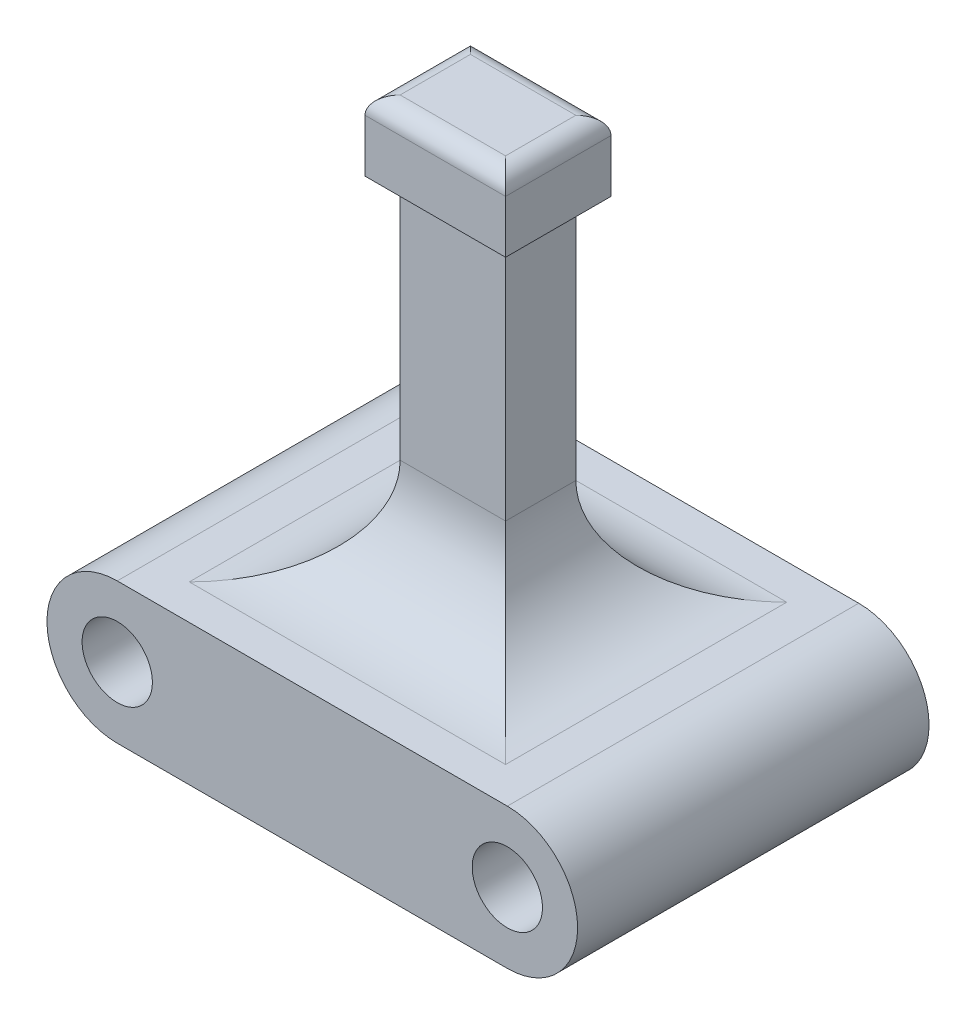
ISO-10303-21;
HEADER;
FILE_DESCRIPTION(('STEP AP214'),'2;1');
FILE_NAME('part.step','',(''),(''),'','','');
FILE_SCHEMA(('AUTOMOTIVE_DESIGN { 1 0 10303 214 1 1 1 1 }'));
ENDSEC;
DATA;
#1=APPLICATION_CONTEXT('core data for automotive mechanical design processes');
#2=APPLICATION_PROTOCOL_DEFINITION('international standard','automotive_design',2000,#1);
#3=PRODUCT_CONTEXT('',#1,'mechanical');
#4=PRODUCT('Part','Part','',(#3));
#5=PRODUCT_RELATED_PRODUCT_CATEGORY('part','',(#4));
#6=PRODUCT_DEFINITION_FORMATION('','',#4);
#7=PRODUCT_DEFINITION_CONTEXT('part definition',#1,'design');
#8=PRODUCT_DEFINITION('design','',#6,#7);
#9=PRODUCT_DEFINITION_SHAPE('','',#8);
#10=(LENGTH_UNIT() NAMED_UNIT(*) SI_UNIT(.MILLI.,.METRE.));
#11=(NAMED_UNIT(*) PLANE_ANGLE_UNIT() SI_UNIT($,.RADIAN.));
#12=(NAMED_UNIT(*) SI_UNIT($,.STERADIAN.) SOLID_ANGLE_UNIT());
#13=UNCERTAINTY_MEASURE_WITH_UNIT(LENGTH_MEASURE(1.E-05),#10,'distance_accuracy_value','');
#14=(GEOMETRIC_REPRESENTATION_CONTEXT(3) GLOBAL_UNCERTAINTY_ASSIGNED_CONTEXT((#13)) GLOBAL_UNIT_ASSIGNED_CONTEXT((#10,
#11,#12)) REPRESENTATION_CONTEXT('',''));
#15=CARTESIAN_POINT('',(0.,0.,0.));
#16=DIRECTION('',(0.,0.,1.));
#17=DIRECTION('',(1.,0.,0.));
#18=AXIS2_PLACEMENT_3D('',#15,#16,#17);
#19=CARTESIAN_POINT('',(0.,2.,10.));
#20=DIRECTION('',(0.,1.,0.));
#21=DIRECTION('',(-1.,0.,0.));
#22=AXIS2_PLACEMENT_3D('',#19,#20,#21);
#23=PLANE('',#22);
#24=DIRECTION('',(0.,0.,1.));
#25=VECTOR('',#24,1.);
#26=CARTESIAN_POINT('',(-4.5,2.,10.));
#27=LINE('',#26,#25);
#28=CARTESIAN_POINT('',(-4.5,2.,9.));
#29=VERTEX_POINT('',#28);
#30=CARTESIAN_POINT('',(-4.5,2.,1.));
#31=VERTEX_POINT('',#30);
#32=EDGE_CURVE('E293',#29,#31,#27,.F.);
#33=ORIENTED_EDGE('',*,*,#32,.T.);
#34=DIRECTION('',(-1.,0.,0.));
#35=VECTOR('',#34,1.);
#36=CARTESIAN_POINT('',(0.,2.,0.999999999999999));
#37=LINE('',#36,#35);
#38=CARTESIAN_POINT('',(4.5,2.,1.));
#39=VERTEX_POINT('',#38);
#40=EDGE_CURVE('E283',#31,#39,#37,.F.);
#41=ORIENTED_EDGE('',*,*,#40,.T.);
#42=DIRECTION('',(0.,0.,-1.));
#43=VECTOR('',#42,1.);
#44=CARTESIAN_POINT('',(4.5,2.,10.));
#45=LINE('',#44,#43);
#46=CARTESIAN_POINT('',(4.5,2.,9.));
#47=VERTEX_POINT('',#46);
#48=EDGE_CURVE('E287',#39,#47,#45,.F.);
#49=ORIENTED_EDGE('',*,*,#48,.T.);
#50=DIRECTION('',(1.,0.,0.));
#51=VECTOR('',#50,1.);
#52=CARTESIAN_POINT('',(0.,2.,9.));
#53=LINE('',#52,#51);
#54=EDGE_CURVE('E290',#47,#29,#53,.F.);
#55=ORIENTED_EDGE('',*,*,#54,.T.);
#56=EDGE_LOOP('',(#33,#41,#49,#55));
#57=FACE_BOUND('',#56,.T.);
#58=DIRECTION('',(1.,0.,0.));
#59=VECTOR('',#58,1.);
#60=CARTESIAN_POINT('',(0.,2.,0.));
#61=LINE('',#60,#59);
#62=CARTESIAN_POINT('',(-5.55,2.,0.));
#63=VERTEX_POINT('',#62);
#64=CARTESIAN_POINT('',(5.55,2.,0.));
#65=VERTEX_POINT('',#64);
#66=EDGE_CURVE('E318',#63,#65,#61,.T.);
#67=ORIENTED_EDGE('',*,*,#66,.F.);
#68=DIRECTION('',(0.,0.,-1.));
#69=VECTOR('',#68,1.);
#70=CARTESIAN_POINT('',(-5.55,2.,10.));
#71=LINE('',#70,#69);
#72=CARTESIAN_POINT('',(-5.55,2.,10.));
#73=VERTEX_POINT('',#72);
#74=EDGE_CURVE('E306',#73,#63,#71,.T.);
#75=ORIENTED_EDGE('',*,*,#74,.F.);
#76=DIRECTION('',(1.,0.,0.));
#77=VECTOR('',#76,1.);
#78=CARTESIAN_POINT('',(0.,2.,10.));
#79=LINE('',#78,#77);
#80=CARTESIAN_POINT('',(5.55,2.,10.));
#81=VERTEX_POINT('',#80);
#82=EDGE_CURVE('E341',#73,#81,#79,.T.);
#83=ORIENTED_EDGE('',*,*,#82,.T.);
#84=DIRECTION('',(0.,0.,-1.));
#85=VECTOR('',#84,1.);
#86=CARTESIAN_POINT('',(5.55,2.,10.));
#87=LINE('',#86,#85);
#88=EDGE_CURVE('E303',#81,#65,#87,.T.);
#89=ORIENTED_EDGE('',*,*,#88,.T.);
#90=EDGE_LOOP('',(#67,#75,#83,#89));
#91=FACE_BOUND('',#90,.T.);
#92=ADVANCED_FACE('F41',(#57,#91),#23,.T.);
#93=CARTESIAN_POINT('',(0.,-2.,10.));
#94=DIRECTION('',(0.,-1.,0.));
#95=DIRECTION('',(1.,0.,0.));
#96=AXIS2_PLACEMENT_3D('',#93,#94,#95);
#97=PLANE('',#96);
#98=DIRECTION('',(-1.,0.,0.));
#99=VECTOR('',#98,1.);
#100=CARTESIAN_POINT('',(0.,-2.,0.));
#101=LINE('',#100,#99);
#102=CARTESIAN_POINT('',(5.55,-2.,0.));
#103=VERTEX_POINT('',#102);
#104=CARTESIAN_POINT('',(-5.55,-2.,0.));
#105=VERTEX_POINT('',#104);
#106=EDGE_CURVE('E326',#103,#105,#101,.T.);
#107=ORIENTED_EDGE('',*,*,#106,.F.);
#108=DIRECTION('',(0.,0.,-1.));
#109=VECTOR('',#108,1.);
#110=CARTESIAN_POINT('',(5.55,-2.,10.));
#111=LINE('',#110,#109);
#112=CARTESIAN_POINT('',(5.55,-2.,10.));
#113=VERTEX_POINT('',#112);
#114=EDGE_CURVE('E300',#113,#103,#111,.T.);
#115=ORIENTED_EDGE('',*,*,#114,.F.);
#116=DIRECTION('',(-1.,0.,0.));
#117=VECTOR('',#116,1.);
#118=CARTESIAN_POINT('',(0.,-2.,10.));
#119=LINE('',#118,#117);
#120=CARTESIAN_POINT('',(-5.55,-2.,10.));
#121=VERTEX_POINT('',#120);
#122=EDGE_CURVE('E348',#113,#121,#119,.T.);
#123=ORIENTED_EDGE('',*,*,#122,.T.);
#124=DIRECTION('',(0.,0.,-1.));
#125=VECTOR('',#124,1.);
#126=CARTESIAN_POINT('',(-5.55,-2.,10.));
#127=LINE('',#126,#125);
#128=EDGE_CURVE('E309',#121,#105,#127,.T.);
#129=ORIENTED_EDGE('',*,*,#128,.T.);
#130=EDGE_LOOP('',(#107,#115,#123,#129));
#131=FACE_BOUND('',#130,.T.);
#132=ADVANCED_FACE('F408',(#131),#97,.T.);
#133=CARTESIAN_POINT('',(5.55,0.,10.));
#134=DIRECTION('',(0.,0.,-1.));
#135=DIRECTION('',(-1.,0.,0.));
#136=AXIS2_PLACEMENT_3D('',#133,#134,#135);
#137=CYLINDRICAL_SURFACE('',#136,2.);
#138=CARTESIAN_POINT('',(5.55,0.,0.));
#139=DIRECTION('',(0.,0.,1.));
#140=DIRECTION('',(1.,0.,0.));
#141=AXIS2_PLACEMENT_3D('',#138,#139,#140);
#142=CIRCLE('',#141,2.);
#143=EDGE_CURVE('E322',#103,#65,#142,.T.);
#144=ORIENTED_EDGE('',*,*,#143,.T.);
#145=ORIENTED_EDGE('',*,*,#88,.F.);
#146=CARTESIAN_POINT('',(5.55,0.,10.));
#147=DIRECTION('',(0.,0.,1.));
#148=DIRECTION('',(1.,0.,0.));
#149=AXIS2_PLACEMENT_3D('',#146,#147,#148);
#150=CIRCLE('',#149,2.);
#151=EDGE_CURVE('E345',#113,#81,#150,.T.);
#152=ORIENTED_EDGE('',*,*,#151,.F.);
#153=ORIENTED_EDGE('',*,*,#114,.T.);
#154=EDGE_LOOP('',(#144,#145,#152,#153));
#155=FACE_BOUND('',#154,.T.);
#156=ADVANCED_FACE('F414',(#155),#137,.T.);
#157=CARTESIAN_POINT('',(5.55,0.,10.));
#158=DIRECTION('',(0.,0.,-1.));
#159=DIRECTION('',(-1.,0.,0.));
#160=AXIS2_PLACEMENT_3D('',#157,#158,#159);
#161=CYLINDRICAL_SURFACE('',#160,1.);
#162=CARTESIAN_POINT('',(5.55,0.,10.));
#163=DIRECTION('',(0.,0.,1.));
#164=DIRECTION('',(1.,0.,0.));
#165=AXIS2_PLACEMENT_3D('',#162,#163,#164);
#166=CIRCLE('',#165,1.);
#167=CARTESIAN_POINT('',(6.55,0.,10.));
#168=VERTEX_POINT('',#167);
#169=EDGE_CURVE('E352',#168,#168,#166,.T.);
#170=ORIENTED_EDGE('',*,*,#169,.T.);
#171=EDGE_LOOP('',(#170));
#172=FACE_BOUND('',#171,.T.);
#173=CARTESIAN_POINT('',(5.55,0.,0.));
#174=DIRECTION('',(0.,0.,1.));
#175=DIRECTION('',(1.,0.,0.));
#176=AXIS2_PLACEMENT_3D('',#173,#174,#175);
#177=CIRCLE('',#176,1.);
#178=CARTESIAN_POINT('',(6.55,0.,0.));
#179=VERTEX_POINT('',#178);
#180=EDGE_CURVE('E330',#179,#179,#177,.T.);
#181=ORIENTED_EDGE('',*,*,#180,.F.);
#182=EDGE_LOOP('',(#181));
#183=FACE_BOUND('',#182,.T.);
#184=ADVANCED_FACE('F423',(#172,#183),#161,.F.);
#185=CARTESIAN_POINT('',(-5.55,0.,10.));
#186=DIRECTION('',(0.,0.,-1.));
#187=DIRECTION('',(-1.,0.,0.));
#188=AXIS2_PLACEMENT_3D('',#185,#186,#187);
#189=CYLINDRICAL_SURFACE('',#188,1.);
#190=CARTESIAN_POINT('',(-5.55,0.,10.));
#191=DIRECTION('',(0.,0.,1.));
#192=DIRECTION('',(1.,0.,0.));
#193=AXIS2_PLACEMENT_3D('',#190,#191,#192);
#194=CIRCLE('',#193,1.);
#195=CARTESIAN_POINT('',(-4.55,0.,10.));
#196=VERTEX_POINT('',#195);
#197=EDGE_CURVE('E317',#196,#196,#194,.T.);
#198=ORIENTED_EDGE('',*,*,#197,.T.);
#199=EDGE_LOOP('',(#198));
#200=FACE_BOUND('',#199,.T.);
#201=CARTESIAN_POINT('',(-5.55,0.,0.));
#202=DIRECTION('',(0.,0.,1.));
#203=DIRECTION('',(1.,0.,0.));
#204=AXIS2_PLACEMENT_3D('',#201,#202,#203);
#205=CIRCLE('',#204,1.);
#206=CARTESIAN_POINT('',(-4.55,0.,0.));
#207=VERTEX_POINT('',#206);
#208=EDGE_CURVE('E334',#207,#207,#205,.T.);
#209=ORIENTED_EDGE('',*,*,#208,.F.);
#210=EDGE_LOOP('',(#209));
#211=FACE_BOUND('',#210,.T.);
#212=ADVANCED_FACE('F428',(#200,#211),#189,.F.);
#213=CARTESIAN_POINT('',(-5.55,0.,10.));
#214=DIRECTION('',(0.,0.,-1.));
#215=DIRECTION('',(-1.,0.,0.));
#216=AXIS2_PLACEMENT_3D('',#213,#214,#215);
#217=CYLINDRICAL_SURFACE('',#216,2.);
#218=CARTESIAN_POINT('',(-5.55,0.,0.));
#219=DIRECTION('',(0.,0.,1.));
#220=DIRECTION('',(1.,0.,0.));
#221=AXIS2_PLACEMENT_3D('',#218,#219,#220);
#222=CIRCLE('',#221,2.);
#223=EDGE_CURVE('E313',#63,#105,#222,.T.);
#224=ORIENTED_EDGE('',*,*,#223,.T.);
#225=ORIENTED_EDGE('',*,*,#128,.F.);
#226=CARTESIAN_POINT('',(-5.55,0.,10.));
#227=DIRECTION('',(0.,0.,1.));
#228=DIRECTION('',(1.,0.,0.));
#229=AXIS2_PLACEMENT_3D('',#226,#227,#228);
#230=CIRCLE('',#229,2.);
#231=EDGE_CURVE('E312',#73,#121,#230,.T.);
#232=ORIENTED_EDGE('',*,*,#231,.F.);
#233=ORIENTED_EDGE('',*,*,#74,.T.);
#234=EDGE_LOOP('',(#224,#225,#232,#233));
#235=FACE_BOUND('',#234,.T.);
#236=ADVANCED_FACE('F420',(#235),#217,.T.);
#237=CARTESIAN_POINT('',(0.,0.,10.));
#238=DIRECTION('',(0.,0.,1.));
#239=DIRECTION('',(1.,0.,0.));
#240=AXIS2_PLACEMENT_3D('',#237,#238,#239);
#241=PLANE('',#240);
#242=ORIENTED_EDGE('',*,*,#197,.F.);
#243=EDGE_LOOP('',(#242));
#244=FACE_BOUND('',#243,.T.);
#245=ORIENTED_EDGE('',*,*,#169,.F.);
#246=EDGE_LOOP('',(#245));
#247=FACE_BOUND('',#246,.T.);
#248=ORIENTED_EDGE('',*,*,#122,.F.);
#249=ORIENTED_EDGE('',*,*,#151,.T.);
#250=ORIENTED_EDGE('',*,*,#82,.F.);
#251=ORIENTED_EDGE('',*,*,#231,.T.);
#252=EDGE_LOOP('',(#248,#249,#250,#251));
#253=FACE_BOUND('',#252,.T.);
#254=ADVANCED_FACE('F616',(#244,#247,#253),#241,.T.);
#255=CARTESIAN_POINT('',(0.,0.,0.));
#256=DIRECTION('',(0.,0.,1.));
#257=DIRECTION('',(1.,0.,0.));
#258=AXIS2_PLACEMENT_3D('',#255,#256,#257);
#259=PLANE('',#258);
#260=ORIENTED_EDGE('',*,*,#208,.T.);
#261=EDGE_LOOP('',(#260));
#262=FACE_BOUND('',#261,.T.);
#263=ORIENTED_EDGE('',*,*,#180,.T.);
#264=EDGE_LOOP('',(#263));
#265=FACE_BOUND('',#264,.T.);
#266=ORIENTED_EDGE('',*,*,#106,.T.);
#267=ORIENTED_EDGE('',*,*,#223,.F.);
#268=ORIENTED_EDGE('',*,*,#66,.T.);
#269=ORIENTED_EDGE('',*,*,#143,.F.);
#270=EDGE_LOOP('',(#266,#267,#268,#269));
#271=FACE_BOUND('',#270,.T.);
#272=ADVANCED_FACE('F580',(#262,#265,#271),#259,.F.);
#273=CARTESIAN_POINT('',(1.5,12.,4.));
#274=DIRECTION('',(-1.,0.,0.));
#275=DIRECTION('',(0.,0.,1.));
#276=AXIS2_PLACEMENT_3D('',#273,#274,#275);
#277=PLANE('',#276);
#278=DIRECTION('',(0.,-1.,0.));
#279=VECTOR('',#278,1.);
#280=CARTESIAN_POINT('',(1.5,12.,4.));
#281=LINE('',#280,#279);
#282=CARTESIAN_POINT('',(1.5,11.5,4.));
#283=VERTEX_POINT('',#282);
#284=CARTESIAN_POINT('',(1.5,5.,4.));
#285=VERTEX_POINT('',#284);
#286=EDGE_CURVE('E338',#283,#285,#281,.T.);
#287=ORIENTED_EDGE('',*,*,#286,.F.);
#288=DIRECTION('',(0.,0.,-1.));
#289=VECTOR('',#288,1.);
#290=CARTESIAN_POINT('',(1.5,11.5,4.));
#291=LINE('',#290,#289);
#292=CARTESIAN_POINT('',(1.5,11.5,6.));
#293=VERTEX_POINT('',#292);
#294=EDGE_CURVE('E249',#283,#293,#291,.F.);
#295=ORIENTED_EDGE('',*,*,#294,.T.);
#296=DIRECTION('',(0.,-1.,0.));
#297=VECTOR('',#296,1.);
#298=CARTESIAN_POINT('',(1.5,12.,6.));
#299=LINE('',#298,#297);
#300=CARTESIAN_POINT('',(1.5,5.,6.));
#301=VERTEX_POINT('',#300);
#302=EDGE_CURVE('E261',#293,#301,#299,.T.);
#303=ORIENTED_EDGE('',*,*,#302,.T.);
#304=DIRECTION('',(0.,0.,-1.));
#305=VECTOR('',#304,1.);
#306=CARTESIAN_POINT('',(1.5,5.,4.));
#307=LINE('',#306,#305);
#308=EDGE_CURVE('E279',#301,#285,#307,.T.);
#309=ORIENTED_EDGE('',*,*,#308,.T.);
#310=EDGE_LOOP('',(#287,#295,#303,#309));
#311=FACE_BOUND('',#310,.T.);
#312=ADVANCED_FACE('F570',(#311),#277,.F.);
#313=CARTESIAN_POINT('',(-1.5,12.,4.));
#314=DIRECTION('',(0.,0.,1.));
#315=DIRECTION('',(1.,0.,0.));
#316=AXIS2_PLACEMENT_3D('',#313,#314,#315);
#317=PLANE('',#316);
#318=DIRECTION('',(0.,-1.,0.));
#319=VECTOR('',#318,1.);
#320=CARTESIAN_POINT('',(-1.5,12.,4.));
#321=LINE('',#320,#319);
#322=CARTESIAN_POINT('',(-1.5,11.5,4.));
#323=VERTEX_POINT('',#322);
#324=CARTESIAN_POINT('',(-1.5,5.,4.));
#325=VERTEX_POINT('',#324);
#326=EDGE_CURVE('E361',#323,#325,#321,.T.);
#327=ORIENTED_EDGE('',*,*,#326,.F.);
#328=DIRECTION('',(-1.,0.,0.));
#329=VECTOR('',#328,1.);
#330=CARTESIAN_POINT('',(-1.5,11.5,4.));
#331=LINE('',#330,#329);
#332=EDGE_CURVE('E252',#323,#283,#331,.F.);
#333=ORIENTED_EDGE('',*,*,#332,.T.);
#334=ORIENTED_EDGE('',*,*,#286,.T.);
#335=DIRECTION('',(-1.,0.,0.));
#336=VECTOR('',#335,1.);
#337=CARTESIAN_POINT('',(-1.5,5.,4.));
#338=LINE('',#337,#336);
#339=EDGE_CURVE('E296',#285,#325,#338,.T.);
#340=ORIENTED_EDGE('',*,*,#339,.T.);
#341=EDGE_LOOP('',(#327,#333,#334,#340));
#342=FACE_BOUND('',#341,.T.);
#343=ADVANCED_FACE('F560',(#342),#317,.F.);
#344=CARTESIAN_POINT('',(-1.5,12.,4.));
#345=DIRECTION('',(1.,0.,0.));
#346=DIRECTION('',(0.,0.,-1.));
#347=AXIS2_PLACEMENT_3D('',#344,#345,#346);
#348=PLANE('',#347);
#349=DIRECTION('',(0.,-1.,0.));
#350=VECTOR('',#349,1.);
#351=CARTESIAN_POINT('',(-1.5,12.,6.));
#352=LINE('',#351,#350);
#353=CARTESIAN_POINT('',(-1.5,11.5,6.));
#354=VERTEX_POINT('',#353);
#355=CARTESIAN_POINT('',(-1.5,5.,6.));
#356=VERTEX_POINT('',#355);
#357=EDGE_CURVE('E364',#354,#356,#352,.T.);
#358=ORIENTED_EDGE('',*,*,#357,.F.);
#359=DIRECTION('',(0.,0.,1.));
#360=VECTOR('',#359,1.);
#361=CARTESIAN_POINT('',(-1.5,11.5,4.));
#362=LINE('',#361,#360);
#363=EDGE_CURVE('E190',#354,#323,#362,.F.);
#364=ORIENTED_EDGE('',*,*,#363,.T.);
#365=ORIENTED_EDGE('',*,*,#326,.T.);
#366=DIRECTION('',(0.,0.,1.));
#367=VECTOR('',#366,1.);
#368=CARTESIAN_POINT('',(-1.5,5.,4.));
#369=LINE('',#368,#367);
#370=EDGE_CURVE('E256',#325,#356,#369,.T.);
#371=ORIENTED_EDGE('',*,*,#370,.T.);
#372=EDGE_LOOP('',(#358,#364,#365,#371));
#373=FACE_BOUND('',#372,.T.);
#374=ADVANCED_FACE('F549',(#373),#348,.F.);
#375=CARTESIAN_POINT('',(-1.5,12.,6.));
#376=DIRECTION('',(0.,0.,-1.));
#377=DIRECTION('',(-1.,0.,0.));
#378=AXIS2_PLACEMENT_3D('',#375,#376,#377);
#379=PLANE('',#378);
#380=ORIENTED_EDGE('',*,*,#302,.F.);
#381=DIRECTION('',(1.,0.,0.));
#382=VECTOR('',#381,1.);
#383=CARTESIAN_POINT('',(-1.5,11.5,6.));
#384=LINE('',#383,#382);
#385=EDGE_CURVE('E246',#293,#354,#384,.F.);
#386=ORIENTED_EDGE('',*,*,#385,.T.);
#387=ORIENTED_EDGE('',*,*,#357,.T.);
#388=DIRECTION('',(1.,0.,0.));
#389=VECTOR('',#388,1.);
#390=CARTESIAN_POINT('',(-1.5,5.,6.));
#391=LINE('',#390,#389);
#392=EDGE_CURVE('E275',#356,#301,#391,.T.);
#393=ORIENTED_EDGE('',*,*,#392,.T.);
#394=EDGE_LOOP('',(#380,#386,#387,#393));
#395=FACE_BOUND('',#394,.T.);
#396=ADVANCED_FACE('F448',(#395),#379,.F.);
#397=CARTESIAN_POINT('',(-1.5,5.,9.));
#398=DIRECTION('',(1.,0.,0.));
#399=DIRECTION('',(0.,1.,0.));
#400=AXIS2_PLACEMENT_3D('',#397,#398,#399);
#401=CYLINDRICAL_SURFACE('',#400,3.);
#402=CARTESIAN_POINT('',(-4.5,5.,9.));
#403=DIRECTION('',(0.707106781186548,0.,0.707106781186547));
#404=DIRECTION('',(-0.707106781186547,0.,0.707106781186548));
#405=AXIS2_PLACEMENT_3D('',#402,#403,#404);
#406=ELLIPSE('',#405,4.24264068711928,3.);
#407=EDGE_CURVE('E262',#29,#356,#406,.T.);
#408=ORIENTED_EDGE('',*,*,#407,.F.);
#409=ORIENTED_EDGE('',*,*,#54,.F.);
#410=CARTESIAN_POINT('',(4.5,5.,9.));
#411=DIRECTION('',(0.707106781186547,0.,-0.707106781186548));
#412=DIRECTION('',(0.707106781186548,0.,0.707106781186547));
#413=AXIS2_PLACEMENT_3D('',#410,#411,#412);
#414=ELLIPSE('',#413,4.24264068711929,3.);
#415=EDGE_CURVE('E257',#301,#47,#414,.F.);
#416=ORIENTED_EDGE('',*,*,#415,.F.);
#417=ORIENTED_EDGE('',*,*,#392,.F.);
#418=EDGE_LOOP('',(#408,#409,#416,#417));
#419=FACE_BOUND('',#418,.T.);
#420=ADVANCED_FACE('F444',(#419),#401,.F.);
#421=CARTESIAN_POINT('',(4.5,5.,4.));
#422=DIRECTION('',(0.,0.,-1.));
#423=DIRECTION('',(-1.,0.,0.));
#424=AXIS2_PLACEMENT_3D('',#421,#422,#423);
#425=CYLINDRICAL_SURFACE('',#424,3.);
#426=ORIENTED_EDGE('',*,*,#415,.T.);
#427=ORIENTED_EDGE('',*,*,#48,.F.);
#428=CARTESIAN_POINT('',(4.5,5.,1.));
#429=DIRECTION('',(-0.707106781186548,0.,-0.707106781186547));
#430=DIRECTION('',(0.707106781186547,0.,-0.707106781186548));
#431=AXIS2_PLACEMENT_3D('',#428,#429,#430);
#432=ELLIPSE('',#431,4.24264068711928,3.);
#433=EDGE_CURVE('E266',#285,#39,#432,.F.);
#434=ORIENTED_EDGE('',*,*,#433,.F.);
#435=ORIENTED_EDGE('',*,*,#308,.F.);
#436=EDGE_LOOP('',(#426,#427,#434,#435));
#437=FACE_BOUND('',#436,.T.);
#438=ADVANCED_FACE('F440',(#437),#425,.F.);
#439=CARTESIAN_POINT('',(-4.5,5.,4.));
#440=DIRECTION('',(0.,0.,1.));
#441=DIRECTION('',(1.,0.,0.));
#442=AXIS2_PLACEMENT_3D('',#439,#440,#441);
#443=CYLINDRICAL_SURFACE('',#442,3.);
#444=ORIENTED_EDGE('',*,*,#407,.T.);
#445=ORIENTED_EDGE('',*,*,#370,.F.);
#446=CARTESIAN_POINT('',(-4.5,5.,1.));
#447=DIRECTION('',(-0.707106781186547,0.,0.707106781186548));
#448=DIRECTION('',(0.707106781186548,0.,0.707106781186547));
#449=AXIS2_PLACEMENT_3D('',#446,#447,#448);
#450=ELLIPSE('',#449,4.24264068711929,3.);
#451=EDGE_CURVE('E162',#31,#325,#450,.T.);
#452=ORIENTED_EDGE('',*,*,#451,.F.);
#453=ORIENTED_EDGE('',*,*,#32,.F.);
#454=EDGE_LOOP('',(#444,#445,#452,#453));
#455=FACE_BOUND('',#454,.T.);
#456=ADVANCED_FACE('F436',(#455),#443,.F.);
#457=CARTESIAN_POINT('',(-1.5,5.,1.));
#458=DIRECTION('',(-1.,0.,0.));
#459=DIRECTION('',(0.,-1.,0.));
#460=AXIS2_PLACEMENT_3D('',#457,#458,#459);
#461=CYLINDRICAL_SURFACE('',#460,3.);
#462=ORIENTED_EDGE('',*,*,#433,.T.);
#463=ORIENTED_EDGE('',*,*,#40,.F.);
#464=ORIENTED_EDGE('',*,*,#451,.T.);
#465=ORIENTED_EDGE('',*,*,#339,.F.);
#466=EDGE_LOOP('',(#462,#463,#464,#465));
#467=FACE_BOUND('',#466,.T.);
#468=ADVANCED_FACE('F433',(#467),#461,.F.);
#469=CARTESIAN_POINT('',(-2.,14.,3.5));
#470=DIRECTION('',(1.,0.,0.));
#471=DIRECTION('',(0.,0.,-1.));
#472=AXIS2_PLACEMENT_3D('',#469,#470,#471);
#473=PLANE('',#472);
#474=DIRECTION('',(0.,-1.,0.));
#475=VECTOR('',#474,1.);
#476=CARTESIAN_POINT('',(-2.,14.,6.5));
#477=LINE('',#476,#475);
#478=CARTESIAN_POINT('',(-2.,13.5,6.5));
#479=VERTEX_POINT('',#478);
#480=CARTESIAN_POINT('',(-2.,12.,6.5));
#481=VERTEX_POINT('',#480);
#482=EDGE_CURVE('E153',#479,#481,#477,.T.);
#483=ORIENTED_EDGE('',*,*,#482,.F.);
#484=DIRECTION('',(0.,0.,1.));
#485=VECTOR('',#484,1.);
#486=CARTESIAN_POINT('',(-2.,13.5,3.5));
#487=LINE('',#486,#485);
#488=CARTESIAN_POINT('',(-2.,13.5,3.5));
#489=VERTEX_POINT('',#488);
#490=EDGE_CURVE('E224',#479,#489,#487,.F.);
#491=ORIENTED_EDGE('',*,*,#490,.T.);
#492=DIRECTION('',(0.,-1.,0.));
#493=VECTOR('',#492,1.);
#494=CARTESIAN_POINT('',(-2.,14.,3.5));
#495=LINE('',#494,#493);
#496=CARTESIAN_POINT('',(-2.,12.,3.5));
#497=VERTEX_POINT('',#496);
#498=EDGE_CURVE('E170',#489,#497,#495,.T.);
#499=ORIENTED_EDGE('',*,*,#498,.T.);
#500=DIRECTION('',(0.,0.,1.));
#501=VECTOR('',#500,1.);
#502=CARTESIAN_POINT('',(-2.,12.,3.5));
#503=LINE('',#502,#501);
#504=EDGE_CURVE('E167',#497,#481,#503,.T.);
#505=ORIENTED_EDGE('',*,*,#504,.T.);
#506=EDGE_LOOP('',(#483,#491,#499,#505));
#507=FACE_BOUND('',#506,.T.);
#508=ADVANCED_FACE('F168',(#507),#473,.F.);
#509=CARTESIAN_POINT('',(2.,14.,6.5));
#510=DIRECTION('',(0.,0.,-1.));
#511=DIRECTION('',(-1.,0.,0.));
#512=AXIS2_PLACEMENT_3D('',#509,#510,#511);
#513=PLANE('',#512);
#514=DIRECTION('',(0.,-1.,0.));
#515=VECTOR('',#514,1.);
#516=CARTESIAN_POINT('',(2.,14.,6.5));
#517=LINE('',#516,#515);
#518=CARTESIAN_POINT('',(2.,13.5,6.5));
#519=VERTEX_POINT('',#518);
#520=CARTESIAN_POINT('',(2.,12.,6.5));
#521=VERTEX_POINT('',#520);
#522=EDGE_CURVE('E163',#519,#521,#517,.T.);
#523=ORIENTED_EDGE('',*,*,#522,.F.);
#524=DIRECTION('',(1.,0.,0.));
#525=VECTOR('',#524,1.);
#526=CARTESIAN_POINT('',(2.,13.5,6.5));
#527=LINE('',#526,#525);
#528=EDGE_CURVE('E51',#519,#479,#527,.F.);
#529=ORIENTED_EDGE('',*,*,#528,.T.);
#530=ORIENTED_EDGE('',*,*,#482,.T.);
#531=DIRECTION('',(1.,0.,0.));
#532=VECTOR('',#531,1.);
#533=CARTESIAN_POINT('',(2.,12.,6.5));
#534=LINE('',#533,#532);
#535=EDGE_CURVE('E157',#481,#521,#534,.T.);
#536=ORIENTED_EDGE('',*,*,#535,.T.);
#537=EDGE_LOOP('',(#523,#529,#530,#536));
#538=FACE_BOUND('',#537,.T.);
#539=ADVANCED_FACE('F155',(#538),#513,.F.);
#540=CARTESIAN_POINT('',(2.,14.,3.5));
#541=DIRECTION('',(-1.,0.,0.));
#542=DIRECTION('',(0.,0.,1.));
#543=AXIS2_PLACEMENT_3D('',#540,#541,#542);
#544=PLANE('',#543);
#545=DIRECTION('',(0.,-1.,0.));
#546=VECTOR('',#545,1.);
#547=CARTESIAN_POINT('',(2.,14.,3.5));
#548=LINE('',#547,#546);
#549=CARTESIAN_POINT('',(2.,13.5,3.5));
#550=VERTEX_POINT('',#549);
#551=CARTESIAN_POINT('',(2.,12.,3.5));
#552=VERTEX_POINT('',#551);
#553=EDGE_CURVE('E371',#550,#552,#548,.T.);
#554=ORIENTED_EDGE('',*,*,#553,.F.);
#555=DIRECTION('',(0.,0.,-1.));
#556=VECTOR('',#555,1.);
#557=CARTESIAN_POINT('',(2.,13.5,3.5));
#558=LINE('',#557,#556);
#559=EDGE_CURVE('E11',#550,#519,#558,.F.);
#560=ORIENTED_EDGE('',*,*,#559,.T.);
#561=ORIENTED_EDGE('',*,*,#522,.T.);
#562=DIRECTION('',(0.,0.,-1.));
#563=VECTOR('',#562,1.);
#564=CARTESIAN_POINT('',(2.,12.,3.5));
#565=LINE('',#564,#563);
#566=EDGE_CURVE('E187',#521,#552,#565,.T.);
#567=ORIENTED_EDGE('',*,*,#566,.T.);
#568=EDGE_LOOP('',(#554,#560,#561,#567));
#569=FACE_BOUND('',#568,.T.);
#570=ADVANCED_FACE('F382',(#569),#544,.F.);
#571=CARTESIAN_POINT('',(2.,14.,3.5));
#572=DIRECTION('',(0.,0.,1.));
#573=DIRECTION('',(1.,0.,0.));
#574=AXIS2_PLACEMENT_3D('',#571,#572,#573);
#575=PLANE('',#574);
#576=ORIENTED_EDGE('',*,*,#498,.F.);
#577=DIRECTION('',(-1.,0.,0.));
#578=VECTOR('',#577,1.);
#579=CARTESIAN_POINT('',(2.,13.5,3.5));
#580=LINE('',#579,#578);
#581=EDGE_CURVE('E227',#489,#550,#580,.F.);
#582=ORIENTED_EDGE('',*,*,#581,.T.);
#583=ORIENTED_EDGE('',*,*,#553,.T.);
#584=DIRECTION('',(-1.,0.,0.));
#585=VECTOR('',#584,1.);
#586=CARTESIAN_POINT('',(2.,12.,3.5));
#587=LINE('',#586,#585);
#588=EDGE_CURVE('E376',#552,#497,#587,.T.);
#589=ORIENTED_EDGE('',*,*,#588,.T.);
#590=EDGE_LOOP('',(#576,#582,#583,#589));
#591=FACE_BOUND('',#590,.T.);
#592=ADVANCED_FACE('F388',(#591),#575,.F.);
#593=CARTESIAN_POINT('',(0.,14.,0.));
#594=DIRECTION('',(0.,-1.,0.));
#595=DIRECTION('',(0.,0.,-1.));
#596=AXIS2_PLACEMENT_3D('',#593,#594,#595);
#597=PLANE('',#596);
#598=DIRECTION('',(0.,0.,-1.));
#599=VECTOR('',#598,1.);
#600=CARTESIAN_POINT('',(1.5,14.,0.));
#601=LINE('',#600,#599);
#602=CARTESIAN_POINT('',(1.5,14.,6.));
#603=VERTEX_POINT('',#602);
#604=CARTESIAN_POINT('',(1.5,14.,4.));
#605=VERTEX_POINT('',#604);
#606=EDGE_CURVE('E241',#603,#605,#601,.T.);
#607=ORIENTED_EDGE('',*,*,#606,.T.);
#608=DIRECTION('',(-1.,0.,0.));
#609=VECTOR('',#608,1.);
#610=CARTESIAN_POINT('',(0.,14.,4.));
#611=LINE('',#610,#609);
#612=CARTESIAN_POINT('',(-1.5,14.,4.));
#613=VERTEX_POINT('',#612);
#614=EDGE_CURVE('E231',#605,#613,#611,.T.);
#615=ORIENTED_EDGE('',*,*,#614,.T.);
#616=DIRECTION('',(0.,0.,1.));
#617=VECTOR('',#616,1.);
#618=CARTESIAN_POINT('',(-1.5,14.,0.));
#619=LINE('',#618,#617);
#620=CARTESIAN_POINT('',(-1.5,14.,6.));
#621=VERTEX_POINT('',#620);
#622=EDGE_CURVE('E235',#613,#621,#619,.T.);
#623=ORIENTED_EDGE('',*,*,#622,.T.);
#624=DIRECTION('',(1.,0.,0.));
#625=VECTOR('',#624,1.);
#626=CARTESIAN_POINT('',(0.,14.,6.));
#627=LINE('',#626,#625);
#628=EDGE_CURVE('E238',#621,#603,#627,.T.);
#629=ORIENTED_EDGE('',*,*,#628,.T.);
#630=EDGE_LOOP('',(#607,#615,#623,#629));
#631=FACE_BOUND('',#630,.T.);
#632=ADVANCED_FACE('F398',(#631),#597,.F.);
#633=CARTESIAN_POINT('',(0.,11.5,6.5));
#634=DIRECTION('',(1.,0.,0.));
#635=DIRECTION('',(0.,0.,-1.));
#636=AXIS2_PLACEMENT_3D('',#633,#634,#635);
#637=CYLINDRICAL_SURFACE('',#636,0.5);
#638=CARTESIAN_POINT('',(-2.,11.5,6.5));
#639=DIRECTION('',(0.707106781186548,0.,0.707106781186547));
#640=DIRECTION('',(-0.707106781186547,0.,0.707106781186548));
#641=AXIS2_PLACEMENT_3D('',#638,#639,#640);
#642=ELLIPSE('',#641,0.707106781186547,0.5);
#643=EDGE_CURVE('E182',#354,#481,#642,.T.);
#644=ORIENTED_EDGE('',*,*,#643,.F.);
#645=ORIENTED_EDGE('',*,*,#385,.F.);
#646=CARTESIAN_POINT('',(2.,11.5,6.5));
#647=DIRECTION('',(0.707106781186547,0.,-0.707106781186548));
#648=DIRECTION('',(0.707106781186548,0.,0.707106781186547));
#649=AXIS2_PLACEMENT_3D('',#646,#647,#648);
#650=ELLIPSE('',#649,0.707106781186548,0.5);
#651=EDGE_CURVE('E176',#521,#293,#650,.F.);
#652=ORIENTED_EDGE('',*,*,#651,.F.);
#653=ORIENTED_EDGE('',*,*,#535,.F.);
#654=EDGE_LOOP('',(#644,#645,#652,#653));
#655=FACE_BOUND('',#654,.T.);
#656=ADVANCED_FACE('F180',(#655),#637,.F.);
#657=CARTESIAN_POINT('',(2.,11.5,0.));
#658=DIRECTION('',(0.,0.,-1.));
#659=DIRECTION('',(-1.,0.,0.));
#660=AXIS2_PLACEMENT_3D('',#657,#658,#659);
#661=CYLINDRICAL_SURFACE('',#660,0.5);
#662=ORIENTED_EDGE('',*,*,#651,.T.);
#663=ORIENTED_EDGE('',*,*,#294,.F.);
#664=CARTESIAN_POINT('',(2.,11.5,3.5));
#665=DIRECTION('',(-0.707106781186548,0.,-0.707106781186547));
#666=DIRECTION('',(0.707106781186547,0.,-0.707106781186548));
#667=AXIS2_PLACEMENT_3D('',#664,#665,#666);
#668=ELLIPSE('',#667,0.707106781186547,0.5);
#669=EDGE_CURVE('E192',#552,#283,#668,.F.);
#670=ORIENTED_EDGE('',*,*,#669,.F.);
#671=ORIENTED_EDGE('',*,*,#566,.F.);
#672=EDGE_LOOP('',(#662,#663,#670,#671));
#673=FACE_BOUND('',#672,.T.);
#674=ADVANCED_FACE('F385',(#673),#661,.F.);
#675=CARTESIAN_POINT('',(-2.,11.5,0.));
#676=DIRECTION('',(0.,0.,1.));
#677=DIRECTION('',(1.,0.,0.));
#678=AXIS2_PLACEMENT_3D('',#675,#676,#677);
#679=CYLINDRICAL_SURFACE('',#678,0.5);
#680=ORIENTED_EDGE('',*,*,#643,.T.);
#681=ORIENTED_EDGE('',*,*,#504,.F.);
#682=CARTESIAN_POINT('',(-2.,11.5,3.5));
#683=DIRECTION('',(-0.707106781186547,0.,0.707106781186548));
#684=DIRECTION('',(0.707106781186548,0.,0.707106781186547));
#685=AXIS2_PLACEMENT_3D('',#682,#683,#684);
#686=ELLIPSE('',#685,0.707106781186548,0.5);
#687=EDGE_CURVE('E197',#323,#497,#686,.T.);
#688=ORIENTED_EDGE('',*,*,#687,.F.);
#689=ORIENTED_EDGE('',*,*,#363,.F.);
#690=EDGE_LOOP('',(#680,#681,#688,#689));
#691=FACE_BOUND('',#690,.T.);
#692=ADVANCED_FACE('F189',(#691),#679,.F.);
#693=CARTESIAN_POINT('',(0.,11.5,3.5));
#694=DIRECTION('',(-1.,0.,0.));
#695=DIRECTION('',(0.,0.,1.));
#696=AXIS2_PLACEMENT_3D('',#693,#694,#695);
#697=CYLINDRICAL_SURFACE('',#696,0.5);
#698=ORIENTED_EDGE('',*,*,#669,.T.);
#699=ORIENTED_EDGE('',*,*,#332,.F.);
#700=ORIENTED_EDGE('',*,*,#687,.T.);
#701=ORIENTED_EDGE('',*,*,#588,.F.);
#702=EDGE_LOOP('',(#698,#699,#700,#701));
#703=FACE_BOUND('',#702,.T.);
#704=ADVANCED_FACE('F386',(#703),#697,.F.);
#705=CARTESIAN_POINT('',(0.,13.5,6.));
#706=DIRECTION('',(1.,0.,0.));
#707=DIRECTION('',(0.,0.,-1.));
#708=AXIS2_PLACEMENT_3D('',#705,#706,#707);
#709=CYLINDRICAL_SURFACE('',#708,0.5);
#710=CARTESIAN_POINT('',(-1.5,13.5,6.));
#711=DIRECTION('',(0.707106781186548,0.,0.707106781186547));
#712=DIRECTION('',(0.707106781186547,0.,-0.707106781186548));
#713=AXIS2_PLACEMENT_3D('',#710,#711,#712);
#714=ELLIPSE('',#713,0.707106781186548,0.5);
#715=EDGE_CURVE('E206',#479,#621,#714,.F.);
#716=ORIENTED_EDGE('',*,*,#715,.F.);
#717=ORIENTED_EDGE('',*,*,#528,.F.);
#718=CARTESIAN_POINT('',(1.5,13.5,6.));
#719=DIRECTION('',(0.707106781186547,0.,-0.707106781186548));
#720=DIRECTION('',(-0.707106781186548,0.,-0.707106781186547));
#721=AXIS2_PLACEMENT_3D('',#718,#719,#720);
#722=ELLIPSE('',#721,0.707106781186547,0.5);
#723=EDGE_CURVE('E45',#603,#519,#722,.T.);
#724=ORIENTED_EDGE('',*,*,#723,.F.);
#725=ORIENTED_EDGE('',*,*,#628,.F.);
#726=EDGE_LOOP('',(#716,#717,#724,#725));
#727=FACE_BOUND('',#726,.T.);
#728=ADVANCED_FACE('F43',(#727),#709,.T.);
#729=CARTESIAN_POINT('',(1.5,13.5,0.));
#730=DIRECTION('',(0.,0.,-1.));
#731=DIRECTION('',(-1.,0.,0.));
#732=AXIS2_PLACEMENT_3D('',#729,#730,#731);
#733=CYLINDRICAL_SURFACE('',#732,0.5);
#734=ORIENTED_EDGE('',*,*,#723,.T.);
#735=ORIENTED_EDGE('',*,*,#559,.F.);
#736=CARTESIAN_POINT('',(1.5,13.5,4.));
#737=DIRECTION('',(-0.707106781186548,0.,-0.707106781186547));
#738=DIRECTION('',(0.707106781186547,0.,-0.707106781186547));
#739=AXIS2_PLACEMENT_3D('',#736,#737,#738);
#740=ELLIPSE('',#739,0.707106781186547,0.5);
#741=EDGE_CURVE('E204',#605,#550,#740,.T.);
#742=ORIENTED_EDGE('',*,*,#741,.F.);
#743=ORIENTED_EDGE('',*,*,#606,.F.);
#744=EDGE_LOOP('',(#734,#735,#742,#743));
#745=FACE_BOUND('',#744,.T.);
#746=ADVANCED_FACE('F399',(#745),#733,.T.);
#747=CARTESIAN_POINT('',(-1.5,13.5,0.));
#748=DIRECTION('',(0.,0.,1.));
#749=DIRECTION('',(1.,0.,0.));
#750=AXIS2_PLACEMENT_3D('',#747,#748,#749);
#751=CYLINDRICAL_SURFACE('',#750,0.5);
#752=ORIENTED_EDGE('',*,*,#715,.T.);
#753=ORIENTED_EDGE('',*,*,#622,.F.);
#754=CARTESIAN_POINT('',(-1.5,13.5,4.));
#755=DIRECTION('',(-0.707106781186547,0.,0.707106781186547));
#756=DIRECTION('',(0.707106781186548,0.,0.707106781186547));
#757=AXIS2_PLACEMENT_3D('',#754,#755,#756);
#758=ELLIPSE('',#757,0.707106781186548,0.5);
#759=EDGE_CURVE('E201',#489,#613,#758,.F.);
#760=ORIENTED_EDGE('',*,*,#759,.F.);
#761=ORIENTED_EDGE('',*,*,#490,.F.);
#762=EDGE_LOOP('',(#752,#753,#760,#761));
#763=FACE_BOUND('',#762,.T.);
#764=ADVANCED_FACE('F395',(#763),#751,.T.);
#765=CARTESIAN_POINT('',(0.,13.5,4.));
#766=DIRECTION('',(-1.,0.,0.));
#767=DIRECTION('',(0.,0.,1.));
#768=AXIS2_PLACEMENT_3D('',#765,#766,#767);
#769=CYLINDRICAL_SURFACE('',#768,0.5);
#770=ORIENTED_EDGE('',*,*,#741,.T.);
#771=ORIENTED_EDGE('',*,*,#581,.F.);
#772=ORIENTED_EDGE('',*,*,#759,.T.);
#773=ORIENTED_EDGE('',*,*,#614,.F.);
#774=EDGE_LOOP('',(#770,#771,#772,#773));
#775=FACE_BOUND('',#774,.T.);
#776=ADVANCED_FACE('F392',(#775),#769,.T.);
#777=CLOSED_SHELL('',(#92,#132,#156,#184,#212,#236,#254,#272,#312,#343,#374,#396,#420,#438,#456,
#468,#508,#539,#570,#592,#632,#656,#674,#692,#704,#728,#746,#764,#776));
#778=MANIFOLD_SOLID_BREP('B2',#777);
#779=ADVANCED_BREP_SHAPE_REPRESENTATION('',(#18,#778),#14);
#780=SHAPE_DEFINITION_REPRESENTATION(#9,#779);
ENDSEC;
END-ISO-10303-21;
